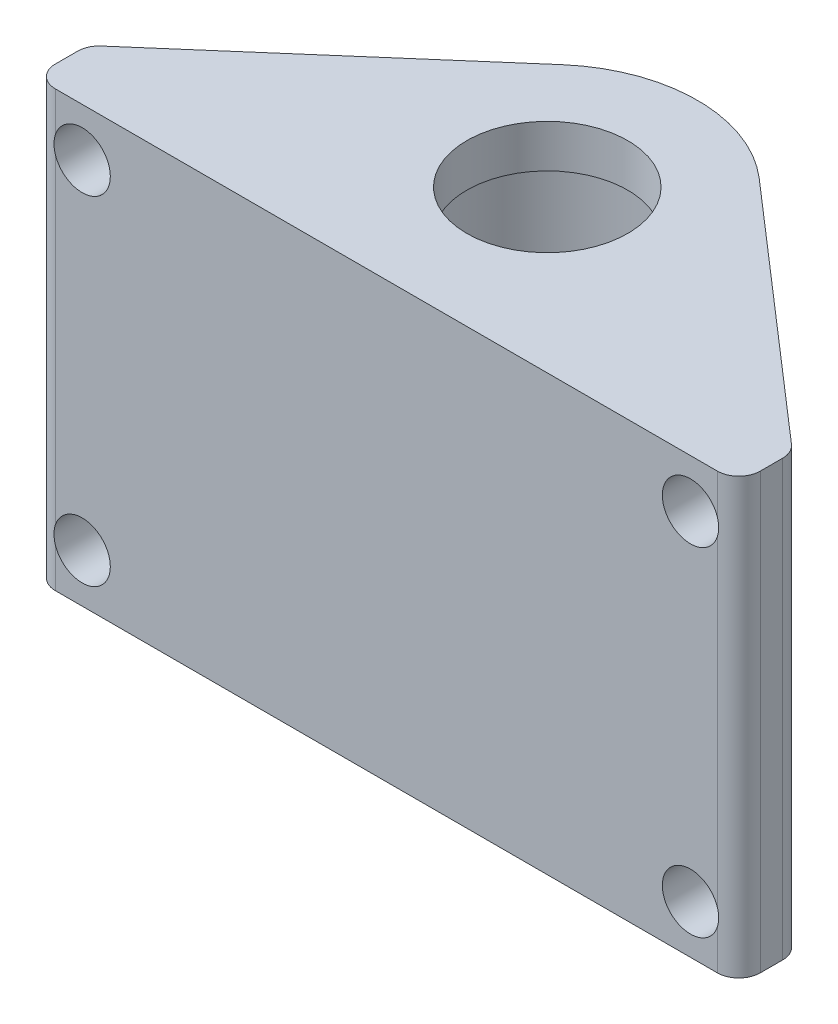
ISO-10303-21;
HEADER;
FILE_DESCRIPTION(('STEP AP214'),'2;1');
FILE_NAME('part.step','',(''),(''),'','','');
FILE_SCHEMA(('AUTOMOTIVE_DESIGN { 1 0 10303 214 1 1 1 1 }'));
ENDSEC;
DATA;
#1=APPLICATION_CONTEXT('core data for automotive mechanical design processes');
#2=APPLICATION_PROTOCOL_DEFINITION('international standard','automotive_design',2000,#1);
#3=PRODUCT_CONTEXT('',#1,'mechanical');
#4=PRODUCT('Part','Part','',(#3));
#5=PRODUCT_RELATED_PRODUCT_CATEGORY('part','',(#4));
#6=PRODUCT_DEFINITION_FORMATION('','',#4);
#7=PRODUCT_DEFINITION_CONTEXT('part definition',#1,'design');
#8=PRODUCT_DEFINITION('design','',#6,#7);
#9=PRODUCT_DEFINITION_SHAPE('','',#8);
#10=(LENGTH_UNIT() NAMED_UNIT(*) SI_UNIT(.MILLI.,.METRE.));
#11=(NAMED_UNIT(*) PLANE_ANGLE_UNIT() SI_UNIT($,.RADIAN.));
#12=(NAMED_UNIT(*) SI_UNIT($,.STERADIAN.) SOLID_ANGLE_UNIT());
#13=UNCERTAINTY_MEASURE_WITH_UNIT(LENGTH_MEASURE(1.E-05),#10,'distance_accuracy_value','');
#14=(GEOMETRIC_REPRESENTATION_CONTEXT(3) GLOBAL_UNCERTAINTY_ASSIGNED_CONTEXT((#13)) GLOBAL_UNIT_ASSIGNED_CONTEXT((#10,
#11,#12)) REPRESENTATION_CONTEXT('',''));
#15=CARTESIAN_POINT('',(0.,0.,0.));
#16=DIRECTION('',(0.,0.,1.));
#17=DIRECTION('',(1.,0.,0.));
#18=AXIS2_PLACEMENT_3D('',#15,#16,#17);
#19=CARTESIAN_POINT('',(21.0947550377728,-51.435,-24.2736863973737));
#20=DIRECTION('',(0.655952068796307,0.,-0.754802545995868));
#21=DIRECTION('',(-0.754802545995868,0.,-0.655952068796307));
#22=AXIS2_PLACEMENT_3D('',#19,#20,#21);
#23=PLANE('',#22);
#24=CARTESIAN_POINT('',(36.000000009,-5.71749999499999,-11.3204626348696));
#25=DIRECTION('',(0.655952068796307,0.,-0.754802545995868));
#26=DIRECTION('',(0.754802545995868,0.,0.655952068796307));
#27=AXIS2_PLACEMENT_3D('',#24,#25,#26);
#28=ELLIPSE('',#27,4.41671801146554,3.33375);
#29=CARTESIAN_POINT('',(39.333750009,-5.71749999499999,-8.42330731795887));
#30=VERTEX_POINT('',#29);
#31=EDGE_CURVE('E199',#30,#30,#28,.F.);
#32=ORIENTED_EDGE('',*,*,#31,.T.);
#33=EDGE_LOOP('',(#32));
#34=FACE_BOUND('',#33,.T.);
#35=DIRECTION('',(-0.754802545995868,0.,-0.655952068796307));
#36=VECTOR('',#35,1.);
#37=CARTESIAN_POINT('',(21.0947550377728,0.,-24.2736863973737));
#38=LINE('',#37,#36);
#39=CARTESIAN_POINT('',(40.8456182547426,0.,-7.10943641383536));
#40=VERTEX_POINT('',#39);
#41=CARTESIAN_POINT('',(11.6628277831983,0.,-32.4703892678065));
#42=VERTEX_POINT('',#41);
#43=EDGE_CURVE('E170',#40,#42,#38,.T.);
#44=ORIENTED_EDGE('',*,*,#43,.F.);
#45=DIRECTION('',(0.,1.,0.));
#46=VECTOR('',#45,1.);
#47=CARTESIAN_POINT('',(40.8456182547426,-51.435,-7.10943641383536));
#48=LINE('',#47,#46);
#49=CARTESIAN_POINT('',(40.8456182547426,-51.435,-7.10943641383536));
#50=VERTEX_POINT('',#49);
#51=EDGE_CURVE('E43',#40,#50,#48,.F.);
#52=ORIENTED_EDGE('',*,*,#51,.T.);
#53=DIRECTION('',(-0.754802545995868,0.,-0.655952068796307));
#54=VECTOR('',#53,1.);
#55=CARTESIAN_POINT('',(21.0947550377728,-51.435,-24.2736863973737));
#56=LINE('',#55,#54);
#57=CARTESIAN_POINT('',(11.6628277831983,-51.435,-32.4703892678065));
#58=VERTEX_POINT('',#57);
#59=EDGE_CURVE('E137',#50,#58,#56,.T.);
#60=ORIENTED_EDGE('',*,*,#59,.T.);
#61=DIRECTION('',(0.,1.,0.));
#62=VECTOR('',#61,1.);
#63=CARTESIAN_POINT('',(11.6628277831983,-51.435,-32.4703892678065));
#64=LINE('',#63,#62);
#65=EDGE_CURVE('E141',#58,#42,#64,.T.);
#66=ORIENTED_EDGE('',*,*,#65,.T.);
#67=EDGE_LOOP('',(#44,#52,#60,#66));
#68=FACE_BOUND('',#67,.T.);
#69=CARTESIAN_POINT('',(36.000000009,-45.717500005,-11.3204626348696));
#70=DIRECTION('',(0.655952068796307,0.,-0.754802545995868));
#71=DIRECTION('',(0.754802545995868,0.,0.655952068796307));
#72=AXIS2_PLACEMENT_3D('',#69,#70,#71);
#73=ELLIPSE('',#72,4.41671801146554,3.33375);
#74=CARTESIAN_POINT('',(39.333750009,-45.717500005,-8.42330731795887));
#75=VERTEX_POINT('',#74);
#76=EDGE_CURVE('E295',#75,#75,#73,.T.);
#77=ORIENTED_EDGE('',*,*,#76,.F.);
#78=EDGE_LOOP('',(#77));
#79=FACE_BOUND('',#78,.T.);
#80=ADVANCED_FACE('F35',(#34,#68,#79),#23,.T.);
#81=CARTESIAN_POINT('',(0.,-51.435,0.));
#82=DIRECTION('',(0.,0.,-1.));
#83=DIRECTION('',(-1.,0.,0.));
#84=AXIS2_PLACEMENT_3D('',#81,#82,#83);
#85=PLANE('',#84);
#86=DIRECTION('',(-1.,0.,0.));
#87=VECTOR('',#86,1.);
#88=CARTESIAN_POINT('',(0.,0.,0.));
#89=LINE('',#88,#87);
#90=CARTESIAN_POINT('',(39.1795,0.,0.));
#91=VERTEX_POINT('',#90);
#92=CARTESIAN_POINT('',(-39.1795,0.,0.));
#93=VERTEX_POINT('',#92);
#94=EDGE_CURVE('E179',#91,#93,#89,.T.);
#95=ORIENTED_EDGE('',*,*,#94,.T.);
#96=DIRECTION('',(0.,1.,0.));
#97=VECTOR('',#96,1.);
#98=CARTESIAN_POINT('',(-39.1795,-51.435,0.));
#99=LINE('',#98,#97);
#100=CARTESIAN_POINT('',(-39.1795,-4.71516827858523,0.));
#101=VERTEX_POINT('',#100);
#102=EDGE_CURVE('E223',#93,#101,#99,.F.);
#103=ORIENTED_EDGE('',*,*,#102,.T.);
#104=CARTESIAN_POINT('',(-36.000000009,-5.717499995,0.));
#105=DIRECTION('',(0.,0.,1.));
#106=DIRECTION('',(1.,0.,0.));
#107=AXIS2_PLACEMENT_3D('',#104,#105,#106);
#108=CIRCLE('',#107,3.33375);
#109=CARTESIAN_POINT('',(-39.1795,-6.71983171141477,0.));
#110=VERTEX_POINT('',#109);
#111=EDGE_CURVE('E196',#110,#101,#108,.T.);
#112=ORIENTED_EDGE('',*,*,#111,.F.);
#113=DIRECTION('',(0.,1.,0.));
#114=VECTOR('',#113,1.);
#115=CARTESIAN_POINT('',(-39.1795,-51.435,0.));
#116=LINE('',#115,#114);
#117=CARTESIAN_POINT('',(-39.1795,-44.7151682885852,0.));
#118=VERTEX_POINT('',#117);
#119=EDGE_CURVE('E221',#110,#118,#116,.F.);
#120=ORIENTED_EDGE('',*,*,#119,.T.);
#121=CARTESIAN_POINT('',(-36.000000009,-45.717500005,0.));
#122=DIRECTION('',(0.,0.,1.));
#123=DIRECTION('',(1.,0.,0.));
#124=AXIS2_PLACEMENT_3D('',#121,#122,#123);
#125=CIRCLE('',#124,3.33375);
#126=CARTESIAN_POINT('',(-39.1795,-46.7198317214148,0.));
#127=VERTEX_POINT('',#126);
#128=EDGE_CURVE('E315',#118,#127,#125,.F.);
#129=ORIENTED_EDGE('',*,*,#128,.T.);
#130=DIRECTION('',(0.,1.,0.));
#131=VECTOR('',#130,1.);
#132=CARTESIAN_POINT('',(-39.1795,-51.435,0.));
#133=LINE('',#132,#131);
#134=CARTESIAN_POINT('',(-39.1795,-51.435,0.));
#135=VERTEX_POINT('',#134);
#136=EDGE_CURVE('E219',#127,#135,#133,.F.);
#137=ORIENTED_EDGE('',*,*,#136,.T.);
#138=DIRECTION('',(-1.,0.,0.));
#139=VECTOR('',#138,1.);
#140=CARTESIAN_POINT('',(0.,-51.435,0.));
#141=LINE('',#140,#139);
#142=CARTESIAN_POINT('',(39.1795,-51.435,0.));
#143=VERTEX_POINT('',#142);
#144=EDGE_CURVE('E167',#143,#135,#141,.T.);
#145=ORIENTED_EDGE('',*,*,#144,.F.);
#146=DIRECTION('',(0.,1.,0.));
#147=VECTOR('',#146,1.);
#148=CARTESIAN_POINT('',(39.1795,0.,0.));
#149=LINE('',#148,#147);
#150=CARTESIAN_POINT('',(39.1795,-46.7198317214148,0.));
#151=VERTEX_POINT('',#150);
#152=EDGE_CURVE('E216',#143,#151,#149,.T.);
#153=ORIENTED_EDGE('',*,*,#152,.T.);
#154=CARTESIAN_POINT('',(36.000000009,-45.717500005,0.));
#155=DIRECTION('',(0.,0.,1.));
#156=DIRECTION('',(1.,0.,0.));
#157=AXIS2_PLACEMENT_3D('',#154,#155,#156);
#158=CIRCLE('',#157,3.33375);
#159=CARTESIAN_POINT('',(39.1795,-44.7151682885852,0.));
#160=VERTEX_POINT('',#159);
#161=EDGE_CURVE('E318',#160,#151,#158,.T.);
#162=ORIENTED_EDGE('',*,*,#161,.F.);
#163=DIRECTION('',(0.,1.,0.));
#164=VECTOR('',#163,1.);
#165=CARTESIAN_POINT('',(39.1795,0.,0.));
#166=LINE('',#165,#164);
#167=CARTESIAN_POINT('',(39.1795,-6.71983171141476,0.));
#168=VERTEX_POINT('',#167);
#169=EDGE_CURVE('E214',#160,#168,#166,.T.);
#170=ORIENTED_EDGE('',*,*,#169,.T.);
#171=CARTESIAN_POINT('',(36.000000009,-5.71749999499999,0.));
#172=DIRECTION('',(0.,0.,1.));
#173=DIRECTION('',(1.,0.,0.));
#174=AXIS2_PLACEMENT_3D('',#171,#172,#173);
#175=CIRCLE('',#174,3.33375);
#176=CARTESIAN_POINT('',(39.1795,-4.71516827858523,0.));
#177=VERTEX_POINT('',#176);
#178=EDGE_CURVE('E314',#168,#177,#175,.F.);
#179=ORIENTED_EDGE('',*,*,#178,.T.);
#180=DIRECTION('',(0.,1.,0.));
#181=VECTOR('',#180,1.);
#182=CARTESIAN_POINT('',(39.1795,0.,0.));
#183=LINE('',#182,#181);
#184=EDGE_CURVE('E212',#177,#91,#183,.T.);
#185=ORIENTED_EDGE('',*,*,#184,.T.);
#186=EDGE_LOOP('',(#95,#103,#112,#120,#129,#137,#145,#153,#162,#170,#179,#185));
#187=FACE_BOUND('',#186,.T.);
#188=ADVANCED_FACE('F277',(#187),#85,.F.);
#189=CARTESIAN_POINT('',(-21.0947550377728,-51.435,-24.2736863973737));
#190=DIRECTION('',(0.655952068796307,0.,0.754802545995868));
#191=DIRECTION('',(0.754802545995868,0.,-0.655952068796307));
#192=AXIS2_PLACEMENT_3D('',#189,#190,#191);
#193=PLANE('',#192);
#194=CARTESIAN_POINT('',(-36.000000009,-5.717499995,-11.3204626348696));
#195=DIRECTION('',(0.655952068796307,0.,0.754802545995868));
#196=DIRECTION('',(-0.754802545995868,0.,0.655952068796307));
#197=AXIS2_PLACEMENT_3D('',#194,#195,#196);
#198=ELLIPSE('',#197,4.41671801146554,3.33375);
#199=CARTESIAN_POINT('',(-39.333750009,-5.717499995,-8.42330731795887));
#200=VERTEX_POINT('',#199);
#201=EDGE_CURVE('E192',#200,#200,#198,.T.);
#202=ORIENTED_EDGE('',*,*,#201,.T.);
#203=EDGE_LOOP('',(#202));
#204=FACE_BOUND('',#203,.T.);
#205=DIRECTION('',(0.754802545995868,0.,-0.655952068796307));
#206=VECTOR('',#205,1.);
#207=CARTESIAN_POINT('',(-21.0947550377728,-51.435,-24.2736863973737));
#208=LINE('',#207,#206);
#209=CARTESIAN_POINT('',(-40.8456182547426,-51.435,-7.10943641383536));
#210=VERTEX_POINT('',#209);
#211=CARTESIAN_POINT('',(-11.6628277831983,-51.435,-32.4703892678065));
#212=VERTEX_POINT('',#211);
#213=EDGE_CURVE('E159',#210,#212,#208,.T.);
#214=ORIENTED_EDGE('',*,*,#213,.F.);
#215=DIRECTION('',(0.,1.,0.));
#216=VECTOR('',#215,1.);
#217=CARTESIAN_POINT('',(-40.8456182547426,-51.435,-7.10943641383536));
#218=LINE('',#217,#216);
#219=CARTESIAN_POINT('',(-40.8456182547426,0.,-7.10943641383536));
#220=VERTEX_POINT('',#219);
#221=EDGE_CURVE('E11',#210,#220,#218,.T.);
#222=ORIENTED_EDGE('',*,*,#221,.T.);
#223=DIRECTION('',(0.754802545995868,0.,-0.655952068796307));
#224=VECTOR('',#223,1.);
#225=CARTESIAN_POINT('',(-21.0947550377728,0.,-24.2736863973737));
#226=LINE('',#225,#224);
#227=CARTESIAN_POINT('',(-11.6628277831983,0.,-32.4703892678065));
#228=VERTEX_POINT('',#227);
#229=EDGE_CURVE('E174',#220,#228,#226,.T.);
#230=ORIENTED_EDGE('',*,*,#229,.T.);
#231=DIRECTION('',(0.,1.,0.));
#232=VECTOR('',#231,1.);
#233=CARTESIAN_POINT('',(-11.6628277831983,-51.435,-32.4703892678065));
#234=LINE('',#233,#232);
#235=EDGE_CURVE('E154',#212,#228,#234,.T.);
#236=ORIENTED_EDGE('',*,*,#235,.F.);
#237=EDGE_LOOP('',(#214,#222,#230,#236));
#238=FACE_BOUND('',#237,.T.);
#239=CARTESIAN_POINT('',(-36.000000009,-45.717500005,-11.3204626348696));
#240=DIRECTION('',(0.655952068796307,0.,0.754802545995868));
#241=DIRECTION('',(-0.754802545995868,0.,0.655952068796307));
#242=AXIS2_PLACEMENT_3D('',#239,#240,#241);
#243=ELLIPSE('',#242,4.41671801146554,3.33375);
#244=CARTESIAN_POINT('',(-39.333750009,-45.717500005,-8.42330731795887));
#245=VERTEX_POINT('',#244);
#246=EDGE_CURVE('E195',#245,#245,#243,.F.);
#247=ORIENTED_EDGE('',*,*,#246,.F.);
#248=EDGE_LOOP('',(#247));
#249=FACE_BOUND('',#248,.T.);
#250=ADVANCED_FACE('F275',(#204,#238,#249),#193,.F.);
#251=CARTESIAN_POINT('',(41.7195,-51.435,0.));
#252=DIRECTION('',(1.,0.,0.));
#253=DIRECTION('',(0.,0.,-1.));
#254=AXIS2_PLACEMENT_3D('',#251,#252,#253);
#255=PLANE('',#254);
#256=DIRECTION('',(0.,0.,-1.));
#257=VECTOR('',#256,1.);
#258=CARTESIAN_POINT('',(41.7195,0.,0.));
#259=LINE('',#258,#257);
#260=CARTESIAN_POINT('',(41.7195,0.,-2.54));
#261=VERTEX_POINT('',#260);
#262=CARTESIAN_POINT('',(41.7195,0.,-5.19223794700585));
#263=VERTEX_POINT('',#262);
#264=EDGE_CURVE('E182',#261,#263,#259,.T.);
#265=ORIENTED_EDGE('',*,*,#264,.F.);
#266=DIRECTION('',(0.,1.,0.));
#267=VECTOR('',#266,1.);
#268=CARTESIAN_POINT('',(41.7195,-51.435,-2.54));
#269=LINE('',#268,#267);
#270=CARTESIAN_POINT('',(41.7195,-51.435,-2.54));
#271=VERTEX_POINT('',#270);
#272=EDGE_CURVE('E335',#261,#271,#269,.F.);
#273=ORIENTED_EDGE('',*,*,#272,.T.);
#274=DIRECTION('',(0.,0.,-1.));
#275=VECTOR('',#274,1.);
#276=CARTESIAN_POINT('',(41.7195,-51.435,0.));
#277=LINE('',#276,#275);
#278=CARTESIAN_POINT('',(41.7195,-51.435,-5.19223794700585));
#279=VERTEX_POINT('',#278);
#280=EDGE_CURVE('E155',#271,#279,#277,.T.);
#281=ORIENTED_EDGE('',*,*,#280,.T.);
#282=DIRECTION('',(0.,1.,0.));
#283=VECTOR('',#282,1.);
#284=CARTESIAN_POINT('',(41.7195,-51.435,-5.19223794700585));
#285=LINE('',#284,#283);
#286=EDGE_CURVE('E340',#279,#263,#285,.T.);
#287=ORIENTED_EDGE('',*,*,#286,.T.);
#288=EDGE_LOOP('',(#265,#273,#281,#287));
#289=FACE_BOUND('',#288,.T.);
#290=ADVANCED_FACE('F271',(#289),#255,.T.);
#291=CARTESIAN_POINT('',(-41.7195,-51.435,0.));
#292=DIRECTION('',(1.,0.,0.));
#293=DIRECTION('',(0.,0.,-1.));
#294=AXIS2_PLACEMENT_3D('',#291,#292,#293);
#295=PLANE('',#294);
#296=DIRECTION('',(0.,0.,-1.));
#297=VECTOR('',#296,1.);
#298=CARTESIAN_POINT('',(-41.7195,-51.435,0.));
#299=LINE('',#298,#297);
#300=CARTESIAN_POINT('',(-41.7195,-51.435,-2.54));
#301=VERTEX_POINT('',#300);
#302=CARTESIAN_POINT('',(-41.7195,-51.435,-5.19223794700585));
#303=VERTEX_POINT('',#302);
#304=EDGE_CURVE('E162',#301,#303,#299,.T.);
#305=ORIENTED_EDGE('',*,*,#304,.F.);
#306=DIRECTION('',(0.,1.,0.));
#307=VECTOR('',#306,1.);
#308=CARTESIAN_POINT('',(-41.7195,-51.435,-2.54));
#309=LINE('',#308,#307);
#310=CARTESIAN_POINT('',(-41.7195,0.,-2.54));
#311=VERTEX_POINT('',#310);
#312=EDGE_CURVE('E201',#301,#311,#309,.T.);
#313=ORIENTED_EDGE('',*,*,#312,.T.);
#314=DIRECTION('',(0.,0.,-1.));
#315=VECTOR('',#314,1.);
#316=CARTESIAN_POINT('',(-41.7195,0.,0.));
#317=LINE('',#316,#315);
#318=CARTESIAN_POINT('',(-41.7195,0.,-5.19223794700585));
#319=VERTEX_POINT('',#318);
#320=EDGE_CURVE('E176',#311,#319,#317,.T.);
#321=ORIENTED_EDGE('',*,*,#320,.T.);
#322=DIRECTION('',(0.,1.,0.));
#323=VECTOR('',#322,1.);
#324=CARTESIAN_POINT('',(-41.7195,-51.435,-5.19223794700585));
#325=LINE('',#324,#323);
#326=EDGE_CURVE('E187',#319,#303,#325,.F.);
#327=ORIENTED_EDGE('',*,*,#326,.T.);
#328=EDGE_LOOP('',(#305,#313,#321,#327));
#329=FACE_BOUND('',#328,.T.);
#330=ADVANCED_FACE('F274',(#329),#295,.F.);
#331=CARTESIAN_POINT('',(0.,-51.435,-19.05));
#332=DIRECTION('',(0.,1.,0.));
#333=DIRECTION('',(0.,0.,1.));
#334=AXIS2_PLACEMENT_3D('',#331,#332,#333);
#335=CYLINDRICAL_SURFACE('',#334,17.78);
#336=CARTESIAN_POINT('',(0.,0.,-19.05));
#337=DIRECTION('',(0.,1.,0.));
#338=DIRECTION('',(0.,0.,1.));
#339=AXIS2_PLACEMENT_3D('',#336,#337,#338);
#340=CIRCLE('',#339,17.78);
#341=EDGE_CURVE('E153',#42,#228,#340,.T.);
#342=ORIENTED_EDGE('',*,*,#341,.F.);
#343=ORIENTED_EDGE('',*,*,#65,.F.);
#344=CARTESIAN_POINT('',(0.,-51.435,-19.05));
#345=DIRECTION('',(0.,1.,0.));
#346=DIRECTION('',(0.,0.,1.));
#347=AXIS2_PLACEMENT_3D('',#344,#345,#346);
#348=CIRCLE('',#347,17.78);
#349=EDGE_CURVE('E145',#58,#212,#348,.T.);
#350=ORIENTED_EDGE('',*,*,#349,.T.);
#351=ORIENTED_EDGE('',*,*,#235,.T.);
#352=EDGE_LOOP('',(#342,#343,#350,#351));
#353=FACE_BOUND('',#352,.T.);
#354=ADVANCED_FACE('F150',(#353),#335,.T.);
#355=CARTESIAN_POINT('',(0.,-51.435,-19.05));
#356=DIRECTION('',(0.,1.,0.));
#357=DIRECTION('',(0.,0.,1.));
#358=AXIS2_PLACEMENT_3D('',#355,#356,#357);
#359=CYLINDRICAL_SURFACE('',#358,9.525);
#360=CARTESIAN_POINT('',(0.,-5.08,-19.05));
#361=DIRECTION('',(0.,1.,0.));
#362=DIRECTION('',(0.,0.,1.));
#363=AXIS2_PLACEMENT_3D('',#360,#361,#362);
#364=CIRCLE('',#363,9.525);
#365=CARTESIAN_POINT('',(0.,-5.08,-9.52499999999999));
#366=VERTEX_POINT('',#365);
#367=EDGE_CURVE('E172',#366,#366,#364,.F.);
#368=ORIENTED_EDGE('',*,*,#367,.T.);
#369=EDGE_LOOP('',(#368));
#370=FACE_BOUND('',#369,.T.);
#371=CARTESIAN_POINT('',(0.,0.,-19.05));
#372=DIRECTION('',(0.,1.,0.));
#373=DIRECTION('',(0.,0.,1.));
#374=AXIS2_PLACEMENT_3D('',#371,#372,#373);
#375=CIRCLE('',#374,9.525);
#376=CARTESIAN_POINT('',(0.,0.,-9.52499999999999));
#377=VERTEX_POINT('',#376);
#378=EDGE_CURVE('E146',#377,#377,#375,.T.);
#379=ORIENTED_EDGE('',*,*,#378,.T.);
#380=EDGE_LOOP('',(#379));
#381=FACE_BOUND('',#380,.T.);
#382=ADVANCED_FACE('F263',(#370,#381),#359,.F.);
#383=CARTESIAN_POINT('',(0.,-51.435,0.));
#384=DIRECTION('',(0.,1.,0.));
#385=DIRECTION('',(0.,0.,1.));
#386=AXIS2_PLACEMENT_3D('',#383,#384,#385);
#387=PLANE('',#386);
#388=CARTESIAN_POINT('',(0.,-51.435,-19.05));
#389=DIRECTION('',(0.,1.,0.));
#390=DIRECTION('',(0.,0.,1.));
#391=AXIS2_PLACEMENT_3D('',#388,#389,#390);
#392=CIRCLE('',#391,12.7);
#393=CARTESIAN_POINT('',(0.,-51.435,-6.34999999999999));
#394=VERTEX_POINT('',#393);
#395=EDGE_CURVE('E191',#394,#394,#392,.T.);
#396=ORIENTED_EDGE('',*,*,#395,.T.);
#397=EDGE_LOOP('',(#396));
#398=FACE_BOUND('',#397,.T.);
#399=ORIENTED_EDGE('',*,*,#144,.T.);
#400=CARTESIAN_POINT('',(-39.1795,-51.435,-2.54));
#401=DIRECTION('',(0.,1.,0.));
#402=DIRECTION('',(0.,0.,1.));
#403=AXIS2_PLACEMENT_3D('',#400,#401,#402);
#404=CIRCLE('',#403,2.54);
#405=EDGE_CURVE('E370',#135,#301,#404,.F.);
#406=ORIENTED_EDGE('',*,*,#405,.T.);
#407=ORIENTED_EDGE('',*,*,#304,.T.);
#408=CARTESIAN_POINT('',(-39.1795,-51.435,-5.19223794700585));
#409=DIRECTION('',(0.,1.,0.));
#410=DIRECTION('',(0.,0.,1.));
#411=AXIS2_PLACEMENT_3D('',#408,#409,#410);
#412=CIRCLE('',#411,2.54);
#413=EDGE_CURVE('E50',#303,#210,#412,.F.);
#414=ORIENTED_EDGE('',*,*,#413,.T.);
#415=ORIENTED_EDGE('',*,*,#213,.T.);
#416=ORIENTED_EDGE('',*,*,#349,.F.);
#417=ORIENTED_EDGE('',*,*,#59,.F.);
#418=CARTESIAN_POINT('',(39.1795,-51.435,-5.19223794700585));
#419=DIRECTION('',(0.,1.,0.));
#420=DIRECTION('',(0.,0.,1.));
#421=AXIS2_PLACEMENT_3D('',#418,#419,#420);
#422=CIRCLE('',#421,2.54);
#423=EDGE_CURVE('E57',#50,#279,#422,.F.);
#424=ORIENTED_EDGE('',*,*,#423,.T.);
#425=ORIENTED_EDGE('',*,*,#280,.F.);
#426=CARTESIAN_POINT('',(39.1795,-51.435,-2.54));
#427=DIRECTION('',(0.,1.,0.));
#428=DIRECTION('',(0.,0.,1.));
#429=AXIS2_PLACEMENT_3D('',#426,#427,#428);
#430=CIRCLE('',#429,2.54);
#431=EDGE_CURVE('E368',#271,#143,#430,.F.);
#432=ORIENTED_EDGE('',*,*,#431,.T.);
#433=EDGE_LOOP('',(#399,#406,#407,#414,#415,#416,#417,#424,#425,#432));
#434=FACE_BOUND('',#433,.T.);
#435=ADVANCED_FACE('F158',(#398,#434),#387,.F.);
#436=CARTESIAN_POINT('',(0.,0.,0.));
#437=DIRECTION('',(0.,1.,0.));
#438=DIRECTION('',(0.,0.,1.));
#439=AXIS2_PLACEMENT_3D('',#436,#437,#438);
#440=PLANE('',#439);
#441=ORIENTED_EDGE('',*,*,#320,.F.);
#442=CARTESIAN_POINT('',(-39.1795,0.,-2.54));
#443=DIRECTION('',(0.,1.,0.));
#444=DIRECTION('',(0.,0.,1.));
#445=AXIS2_PLACEMENT_3D('',#442,#443,#444);
#446=CIRCLE('',#445,2.54);
#447=EDGE_CURVE('E210',#311,#93,#446,.T.);
#448=ORIENTED_EDGE('',*,*,#447,.T.);
#449=ORIENTED_EDGE('',*,*,#94,.F.);
#450=CARTESIAN_POINT('',(39.1795,0.,-2.54));
#451=DIRECTION('',(0.,1.,0.));
#452=DIRECTION('',(0.,0.,1.));
#453=AXIS2_PLACEMENT_3D('',#450,#451,#452);
#454=CIRCLE('',#453,2.54);
#455=EDGE_CURVE('E208',#91,#261,#454,.T.);
#456=ORIENTED_EDGE('',*,*,#455,.T.);
#457=ORIENTED_EDGE('',*,*,#264,.T.);
#458=CARTESIAN_POINT('',(39.1795,0.,-5.19223794700585));
#459=DIRECTION('',(0.,1.,0.));
#460=DIRECTION('',(0.,0.,1.));
#461=AXIS2_PLACEMENT_3D('',#458,#459,#460);
#462=CIRCLE('',#461,2.54);
#463=EDGE_CURVE('E206',#263,#40,#462,.T.);
#464=ORIENTED_EDGE('',*,*,#463,.T.);
#465=ORIENTED_EDGE('',*,*,#43,.T.);
#466=ORIENTED_EDGE('',*,*,#341,.T.);
#467=ORIENTED_EDGE('',*,*,#229,.F.);
#468=CARTESIAN_POINT('',(-39.1795,0.,-5.19223794700585));
#469=DIRECTION('',(0.,1.,0.));
#470=DIRECTION('',(0.,0.,1.));
#471=AXIS2_PLACEMENT_3D('',#468,#469,#470);
#472=CIRCLE('',#471,2.54);
#473=EDGE_CURVE('E204',#220,#319,#472,.T.);
#474=ORIENTED_EDGE('',*,*,#473,.T.);
#475=EDGE_LOOP('',(#441,#448,#449,#456,#457,#464,#465,#466,#467,#474));
#476=FACE_BOUND('',#475,.T.);
#477=ORIENTED_EDGE('',*,*,#378,.F.);
#478=EDGE_LOOP('',(#477));
#479=FACE_BOUND('',#478,.T.);
#480=ADVANCED_FACE('F256',(#476,#479),#440,.T.);
#481=CARTESIAN_POINT('',(0.,-5.08,-19.05));
#482=DIRECTION('',(0.,1.,0.));
#483=DIRECTION('',(0.,0.,1.));
#484=AXIS2_PLACEMENT_3D('',#481,#482,#483);
#485=PLANE('',#484);
#486=CARTESIAN_POINT('',(0.,-5.08,-19.05));
#487=DIRECTION('',(0.,1.,0.));
#488=DIRECTION('',(0.,0.,1.));
#489=AXIS2_PLACEMENT_3D('',#486,#487,#488);
#490=CIRCLE('',#489,12.7);
#491=CARTESIAN_POINT('',(0.,-5.07999999999999,-6.34999999999999));
#492=VERTEX_POINT('',#491);
#493=EDGE_CURVE('E298',#492,#492,#490,.T.);
#494=ORIENTED_EDGE('',*,*,#493,.F.);
#495=EDGE_LOOP('',(#494));
#496=FACE_BOUND('',#495,.T.);
#497=ORIENTED_EDGE('',*,*,#367,.F.);
#498=EDGE_LOOP('',(#497));
#499=FACE_BOUND('',#498,.T.);
#500=ADVANCED_FACE('F253',(#496,#499),#485,.F.);
#501=CARTESIAN_POINT('',(0.,-51.435,-19.05));
#502=DIRECTION('',(0.,1.,0.));
#503=DIRECTION('',(0.,0.,1.));
#504=AXIS2_PLACEMENT_3D('',#501,#502,#503);
#505=CYLINDRICAL_SURFACE('',#504,12.7);
#506=CARTESIAN_POINT('',(0.,-51.435,-6.34999999999999));
#507=CARTESIAN_POINT('',(0.,-50.9521354166667,-6.34999999999999));
#508=CARTESIAN_POINT('',(0.,-50.4692708333333,-6.34999999999999));
#509=CARTESIAN_POINT('',(0.,-49.5035416666667,-6.34999999999999));
#510=CARTESIAN_POINT('',(0.,-49.0206770833333,-6.34999999999999));
#511=CARTESIAN_POINT('',(0.,-48.0549479166667,-6.34999999999999));
#512=CARTESIAN_POINT('',(0.,-47.5720833333333,-6.34999999999999));
#513=CARTESIAN_POINT('',(0.,-46.6063541666667,-6.34999999999999));
#514=CARTESIAN_POINT('',(0.,-46.1234895833333,-6.34999999999999));
#515=CARTESIAN_POINT('',(0.,-45.1577604166667,-6.34999999999999));
#516=CARTESIAN_POINT('',(0.,-44.6748958333333,-6.34999999999999));
#517=CARTESIAN_POINT('',(0.,-43.7091666666667,-6.34999999999999));
#518=CARTESIAN_POINT('',(0.,-43.2263020833333,-6.34999999999999));
#519=CARTESIAN_POINT('',(0.,-42.2605729166667,-6.34999999999999));
#520=CARTESIAN_POINT('',(0.,-41.7777083333333,-6.34999999999999));
#521=CARTESIAN_POINT('',(0.,-40.8119791666667,-6.34999999999999));
#522=CARTESIAN_POINT('',(0.,-40.3291145833333,-6.34999999999999));
#523=CARTESIAN_POINT('',(0.,-39.3633854166667,-6.34999999999999));
#524=CARTESIAN_POINT('',(0.,-38.8805208333333,-6.34999999999999));
#525=CARTESIAN_POINT('',(0.,-37.9147916666667,-6.34999999999999));
#526=CARTESIAN_POINT('',(0.,-37.4319270833333,-6.34999999999999));
#527=CARTESIAN_POINT('',(0.,-36.4661979166667,-6.34999999999999));
#528=CARTESIAN_POINT('',(0.,-35.9833333333333,-6.34999999999999));
#529=CARTESIAN_POINT('',(0.,-35.0176041666667,-6.34999999999999));
#530=CARTESIAN_POINT('',(0.,-34.5347395833333,-6.34999999999999));
#531=CARTESIAN_POINT('',(0.,-33.5690104166667,-6.34999999999999));
#532=CARTESIAN_POINT('',(0.,-33.0861458333333,-6.34999999999999));
#533=CARTESIAN_POINT('',(0.,-32.1204166666667,-6.34999999999999));
#534=CARTESIAN_POINT('',(0.,-31.6375520833333,-6.34999999999999));
#535=CARTESIAN_POINT('',(0.,-30.6718229166667,-6.34999999999999));
#536=CARTESIAN_POINT('',(0.,-30.1889583333333,-6.34999999999999));
#537=CARTESIAN_POINT('',(0.,-29.2232291666667,-6.34999999999999));
#538=CARTESIAN_POINT('',(0.,-28.7403645833333,-6.34999999999999));
#539=CARTESIAN_POINT('',(0.,-27.7746354166667,-6.34999999999999));
#540=CARTESIAN_POINT('',(0.,-27.2917708333333,-6.34999999999999));
#541=CARTESIAN_POINT('',(0.,-26.3260416666667,-6.34999999999999));
#542=CARTESIAN_POINT('',(0.,-25.8431770833333,-6.34999999999999));
#543=CARTESIAN_POINT('',(0.,-24.8774479166667,-6.34999999999999));
#544=CARTESIAN_POINT('',(0.,-24.3945833333333,-6.34999999999999));
#545=CARTESIAN_POINT('',(0.,-23.4288541666667,-6.34999999999999));
#546=CARTESIAN_POINT('',(0.,-22.9459895833333,-6.34999999999999));
#547=CARTESIAN_POINT('',(0.,-21.9802604166667,-6.34999999999999));
#548=CARTESIAN_POINT('',(0.,-21.4973958333333,-6.34999999999999));
#549=CARTESIAN_POINT('',(0.,-20.5316666666667,-6.34999999999999));
#550=CARTESIAN_POINT('',(0.,-20.0488020833333,-6.34999999999999));
#551=CARTESIAN_POINT('',(0.,-19.0830729166667,-6.34999999999999));
#552=CARTESIAN_POINT('',(0.,-18.6002083333333,-6.34999999999999));
#553=CARTESIAN_POINT('',(0.,-17.6344791666667,-6.34999999999999));
#554=CARTESIAN_POINT('',(0.,-17.1516145833333,-6.34999999999999));
#555=CARTESIAN_POINT('',(0.,-16.1858854166667,-6.34999999999999));
#556=CARTESIAN_POINT('',(0.,-15.7030208333333,-6.34999999999999));
#557=CARTESIAN_POINT('',(0.,-14.7372916666667,-6.34999999999999));
#558=CARTESIAN_POINT('',(0.,-14.2544270833333,-6.34999999999999));
#559=CARTESIAN_POINT('',(0.,-13.2886979166667,-6.34999999999999));
#560=CARTESIAN_POINT('',(0.,-12.8058333333333,-6.34999999999999));
#561=CARTESIAN_POINT('',(0.,-11.8401041666667,-6.34999999999999));
#562=CARTESIAN_POINT('',(0.,-11.3572395833333,-6.34999999999999));
#563=CARTESIAN_POINT('',(0.,-10.3915104166667,-6.34999999999999));
#564=CARTESIAN_POINT('',(0.,-9.90864583333333,-6.34999999999999));
#565=CARTESIAN_POINT('',(0.,-8.94291666666666,-6.34999999999999));
#566=CARTESIAN_POINT('',(0.,-8.46005208333333,-6.34999999999999));
#567=CARTESIAN_POINT('',(0.,-7.49432291666666,-6.34999999999999));
#568=CARTESIAN_POINT('',(0.,-7.01145833333333,-6.34999999999999));
#569=CARTESIAN_POINT('',(0.,-6.04572916666666,-6.34999999999999));
#570=CARTESIAN_POINT('',(0.,-5.56286458333333,-6.34999999999999));
#571=CARTESIAN_POINT('',(0.,-5.07999999999999,-6.34999999999999));
#572=B_SPLINE_CURVE_WITH_KNOTS('',3,(#506,#507,#508,#509,#510,#511,#512,#513,#514,#515,#516,
#517,#518,#519,#520,#521,#522,#523,#524,#525,#526,#527,#528,#529,#530,#531,#532,#533,#534,#535,
#536,#537,#538,#539,#540,#541,#542,#543,#544,#545,#546,#547,#548,#549,#550,#551,#552,#553,#554,
#555,#556,#557,#558,#559,#560,#561,#562,#563,#564,#565,#566,#567,#568,#569,#570,#571),
.UNSPECIFIED.,.F.,.F.,(4,2,2,2,2,2,2,2,2,2,2,2,2,2,2,2,2,2,2,2,2,2,2,2,2,2,2,2,2,2,2,2,4),(0.,
1.44859375,2.8971875,4.34578125,5.794375,7.24296874999999,8.6915625,10.14015625,11.58875,
13.03734375,14.4859375,15.93453125,17.383125,18.83171875,20.2803125,21.72890625,23.1775,
24.62609375,26.0746875,27.52328125,28.971875,30.42046875,31.8690625,33.31765625,34.76625,
36.21484375,37.6634375,39.11203125,40.560625,42.00921875,43.4578125,44.90640625,46.355),.UNSPECIFIED.);
#573=EDGE_CURVE('BSEAM249',#394,#492,#572,.T.);
#574=ORIENTED_EDGE('',*,*,#395,.F.);
#575=ORIENTED_EDGE('',*,*,#493,.T.);
#576=ORIENTED_EDGE('',*,*,#573,.T.);
#577=ORIENTED_EDGE('',*,*,#573,.F.);
#578=EDGE_LOOP('',(#574,#576,#575,#577));
#579=FACE_BOUND('',#578,.T.);
#580=ADVANCED_FACE('F249',(#579),#505,.F.);
#581=CARTESIAN_POINT('',(-36.000000009,-5.717499995,-36.83));
#582=DIRECTION('',(0.,0.,1.));
#583=DIRECTION('',(1.,0.,0.));
#584=AXIS2_PLACEMENT_3D('',#581,#582,#583);
#585=CYLINDRICAL_SURFACE('',#584,3.33375);
#586=ORIENTED_EDGE('',*,*,#111,.T.);
#587=CARTESIAN_POINT('',(-39.1795,-4.71516827858523,0.));
#588=CARTESIAN_POINT('',(-39.1960617200469,-4.76770403639957,-2.88076229618965E-06));
#589=CARTESIAN_POINT('',(-39.2113182610125,-4.82064090438852,-0.000161552774359476));
#590=CARTESIAN_POINT('',(-39.2391906617561,-4.92720434478483,-0.000662715148670126));
#591=CARTESIAN_POINT('',(-39.2518065301248,-4.98083091494781,-0.00100520491290415));
#592=CARTESIAN_POINT('',(-39.2856483409078,-5.1425795507336,-0.00211677608651915));
#593=CARTESIAN_POINT('',(-39.3028676788911,-5.25156797031461,-0.0029699467831359));
#594=CARTESIAN_POINT('',(-39.3260882846867,-5.46753456505295,-0.00420795860384838));
#595=CARTESIAN_POINT('',(-39.3323988929116,-5.57448000922065,-0.00460560219897442));
#596=CARTESIAN_POINT('',(-39.3347112834678,-5.78842013990482,-0.00474669550321733));
#597=CARTESIAN_POINT('',(-39.3307186526918,-5.89541476829336,-0.00449049975508373));
#598=CARTESIAN_POINT('',(-39.3112459238117,-6.12273418773525,-0.00339606678016773));
#599=CARTESIAN_POINT('',(-39.2943086468143,-6.24293930396993,-0.00248495129382831));
#600=CARTESIAN_POINT('',(-39.2589848534156,-6.42227719167054,-0.00121747804677667));
#601=CARTESIAN_POINT('',(-39.24540020272,-6.4823951445868,-0.000808519203277497));
#602=CARTESIAN_POINT('',(-39.2149216190968,-6.60178598804488,-0.000202025270433159));
#603=CARTESIAN_POINT('',(-39.1980277508572,-6.66105889508124,-4.48604877683041E-06));
#604=CARTESIAN_POINT('',(-39.1795,-6.71983171141476,0.));
#605=B_SPLINE_CURVE_WITH_KNOTS('',3,(#587,#588,#589,#590,#591,#592,#593,#594,#595,#596,#597,
#598,#599,#600,#601,#602,#603,#604),.UNSPECIFIED.,.F.,.F.,(4,2,2,2,2,2,2,2,4),(0.,
0.165216865236663,0.330433192977415,0.66087390048775,0.981780387494059,1.30251290073641,
1.66590195790713,1.85072568670602,2.03554580295892),.UNSPECIFIED.);
#606=EDGE_CURVE('E225',#101,#110,#605,.T.);
#607=ORIENTED_EDGE('',*,*,#606,.T.);
#608=EDGE_LOOP('',(#586,#607));
#609=FACE_BOUND('',#608,.T.);
#610=ORIENTED_EDGE('',*,*,#201,.F.);
#611=EDGE_LOOP('',(#610));
#612=FACE_BOUND('',#611,.T.);
#613=ADVANCED_FACE('F244',(#609,#612),#585,.F.);
#614=CARTESIAN_POINT('',(-36.000000009,-45.717500005,-36.83));
#615=DIRECTION('',(0.,0.,1.));
#616=DIRECTION('',(1.,0.,0.));
#617=AXIS2_PLACEMENT_3D('',#614,#615,#616);
#618=CYLINDRICAL_SURFACE('',#617,3.33375);
#619=ORIENTED_EDGE('',*,*,#128,.F.);
#620=CARTESIAN_POINT('',(-39.1795,-44.7151682885852,0.));
#621=CARTESIAN_POINT('',(-39.1960617200469,-44.7677040463996,-2.88076229619583E-06));
#622=CARTESIAN_POINT('',(-39.2113182610125,-44.8206409143885,-0.000161552774359485));
#623=CARTESIAN_POINT('',(-39.2391906617561,-44.9272043547848,-0.000662715148670103));
#624=CARTESIAN_POINT('',(-39.2518065301248,-44.9808309249478,-0.00100520491290408));
#625=CARTESIAN_POINT('',(-39.2856483409078,-45.1425795607336,-0.00211677608651895));
#626=CARTESIAN_POINT('',(-39.3028676788911,-45.2515679803146,-0.00296994678313562));
#627=CARTESIAN_POINT('',(-39.3260882846867,-45.4675345750529,-0.00420795860384837));
#628=CARTESIAN_POINT('',(-39.3323988929116,-45.5744800192206,-0.00460560219897474));
#629=CARTESIAN_POINT('',(-39.3347112834678,-45.7884201499048,-0.00474669550321766));
#630=CARTESIAN_POINT('',(-39.3307186526918,-45.8954147782934,-0.00449049975508372));
#631=CARTESIAN_POINT('',(-39.3112459238117,-46.1227341977352,-0.00339606678016745));
#632=CARTESIAN_POINT('',(-39.2943086468143,-46.2429393139699,-0.00248495129382814));
#633=CARTESIAN_POINT('',(-39.2589848534156,-46.4222772016705,-0.00121747804677666));
#634=CARTESIAN_POINT('',(-39.24540020272,-46.4823951545868,-0.00080851920327753));
#635=CARTESIAN_POINT('',(-39.2149216190968,-46.6017859980449,-0.000202025270433206));
#636=CARTESIAN_POINT('',(-39.1980277508572,-46.6610589050812,-4.48604877684717E-06));
#637=CARTESIAN_POINT('',(-39.1795,-46.7198317214148,0.));
#638=B_SPLINE_CURVE_WITH_KNOTS('',3,(#620,#621,#622,#623,#624,#625,#626,#627,#628,#629,#630,
#631,#632,#633,#634,#635,#636,#637),.UNSPECIFIED.,.F.,.F.,(4,2,2,2,2,2,2,2,4),(0.,
0.165216865236666,0.330433192977407,0.660873900487746,0.981780387494053,1.3025129007364,
1.66590195790714,1.85072568670603,2.03554580295893),.UNSPECIFIED.);
#639=EDGE_CURVE('E233',#118,#127,#638,.T.);
#640=ORIENTED_EDGE('',*,*,#639,.T.);
#641=EDGE_LOOP('',(#619,#640));
#642=FACE_BOUND('',#641,.T.);
#643=ORIENTED_EDGE('',*,*,#246,.T.);
#644=EDGE_LOOP('',(#643));
#645=FACE_BOUND('',#644,.T.);
#646=ADVANCED_FACE('F248',(#642,#645),#618,.F.);
#647=CARTESIAN_POINT('',(36.000000009,-5.71749999499999,-36.83));
#648=DIRECTION('',(0.,0.,1.));
#649=DIRECTION('',(1.,0.,0.));
#650=AXIS2_PLACEMENT_3D('',#647,#648,#649);
#651=CYLINDRICAL_SURFACE('',#650,3.33375);
#652=ORIENTED_EDGE('',*,*,#31,.F.);
#653=EDGE_LOOP('',(#652));
#654=FACE_BOUND('',#653,.T.);
#655=ORIENTED_EDGE('',*,*,#178,.F.);
#656=CARTESIAN_POINT('',(39.1795,-6.71983171141476,0.));
#657=CARTESIAN_POINT('',(39.1960617200469,-6.66729595360042,-2.88076229618965E-06));
#658=CARTESIAN_POINT('',(39.2113182610125,-6.61435908561147,-0.000161552774359476));
#659=CARTESIAN_POINT('',(39.2391906617561,-6.50779564521517,-0.000662715148670126));
#660=CARTESIAN_POINT('',(39.2518065301248,-6.45416907505218,-0.00100520491290415));
#661=CARTESIAN_POINT('',(39.2856483409078,-6.29242043926639,-0.00211677608651915));
#662=CARTESIAN_POINT('',(39.3028676788911,-6.18343201968539,-0.0029699467831359));
#663=CARTESIAN_POINT('',(39.3260882846867,-5.96746542494704,-0.00420795860384838));
#664=CARTESIAN_POINT('',(39.3323988929116,-5.86051998077934,-0.00460560219897442));
#665=CARTESIAN_POINT('',(39.3347112834678,-5.64657985009518,-0.00474669550321733));
#666=CARTESIAN_POINT('',(39.3307186526918,-5.53958522170663,-0.00449049975508373));
#667=CARTESIAN_POINT('',(39.3112459238117,-5.31226580226474,-0.00339606678016773));
#668=CARTESIAN_POINT('',(39.2943086468143,-5.19206068603006,-0.00248495129382831));
#669=CARTESIAN_POINT('',(39.2589848534156,-5.01272279832945,-0.00121747804677667));
#670=CARTESIAN_POINT('',(39.24540020272,-4.95260484541319,-0.000808519203277497));
#671=CARTESIAN_POINT('',(39.2149216190968,-4.83321400195511,-0.000202025270433159));
#672=CARTESIAN_POINT('',(39.1980277508572,-4.77394109491875,-4.48604877683041E-06));
#673=CARTESIAN_POINT('',(39.1795,-4.71516827858523,0.));
#674=B_SPLINE_CURVE_WITH_KNOTS('',3,(#656,#657,#658,#659,#660,#661,#662,#663,#664,#665,#666,
#667,#668,#669,#670,#671,#672,#673),.UNSPECIFIED.,.F.,.F.,(4,2,2,2,2,2,2,2,4),(0.,
0.165216865236663,0.330433192977415,0.66087390048775,0.981780387494059,1.30251290073641,
1.66590195790713,1.85072568670602,2.03554580295892),.UNSPECIFIED.);
#675=EDGE_CURVE('E333',#168,#177,#674,.T.);
#676=ORIENTED_EDGE('',*,*,#675,.T.);
#677=EDGE_LOOP('',(#655,#676));
#678=FACE_BOUND('',#677,.T.);
#679=ADVANCED_FACE('F357',(#654,#678),#651,.F.);
#680=CARTESIAN_POINT('',(36.000000009,-45.717500005,-36.83));
#681=DIRECTION('',(0.,0.,1.));
#682=DIRECTION('',(1.,0.,0.));
#683=AXIS2_PLACEMENT_3D('',#680,#681,#682);
#684=CYLINDRICAL_SURFACE('',#683,3.33375);
#685=ORIENTED_EDGE('',*,*,#76,.T.);
#686=EDGE_LOOP('',(#685));
#687=FACE_BOUND('',#686,.T.);
#688=ORIENTED_EDGE('',*,*,#161,.T.);
#689=CARTESIAN_POINT('',(39.1795,-46.7198317214148,0.));
#690=CARTESIAN_POINT('',(39.1960617200469,-46.6672959636004,-2.88076229607753E-06));
#691=CARTESIAN_POINT('',(39.2113182610125,-46.6143590956115,-0.000161552774359298));
#692=CARTESIAN_POINT('',(39.2391906617561,-46.5077956552152,-0.000662715148669864));
#693=CARTESIAN_POINT('',(39.2518065301248,-46.4541690850522,-0.00100520491290387));
#694=CARTESIAN_POINT('',(39.2856483409078,-46.2924204492664,-0.00211677608651886));
#695=CARTESIAN_POINT('',(39.3028676788911,-46.1834320296854,-0.00296994678313567));
#696=CARTESIAN_POINT('',(39.3260882846867,-45.9674654349471,-0.0042079586038483));
#697=CARTESIAN_POINT('',(39.3323988929116,-45.8605199907794,-0.00460560219897445));
#698=CARTESIAN_POINT('',(39.3347112834678,-45.6465798600952,-0.00474669550321748));
#699=CARTESIAN_POINT('',(39.3307186526918,-45.5395852317066,-0.00449049975508388));
#700=CARTESIAN_POINT('',(39.3112459238117,-45.3122658122648,-0.00339606678016784));
#701=CARTESIAN_POINT('',(39.2943086468143,-45.1920606960301,-0.00248495129382838));
#702=CARTESIAN_POINT('',(39.2589848534156,-45.0127228083295,-0.00121747804677663));
#703=CARTESIAN_POINT('',(39.24540020272,-44.9526048554132,-0.000808519203277407));
#704=CARTESIAN_POINT('',(39.2149216190968,-44.8332140119551,-0.00020202527043296));
#705=CARTESIAN_POINT('',(39.1980277508572,-44.7739411049188,-4.48604877657422E-06));
#706=CARTESIAN_POINT('',(39.1795,-44.7151682885852,0.));
#707=B_SPLINE_CURVE_WITH_KNOTS('',3,(#689,#690,#691,#692,#693,#694,#695,#696,#697,#698,#699,
#700,#701,#702,#703,#704,#705,#706),.UNSPECIFIED.,.F.,.F.,(4,2,2,2,2,2,2,2,4),(0.,
0.165216865236659,0.330433192977407,0.660873900487753,0.98178038749406,1.30251290073641,
1.66590195790714,1.85072568670603,2.03554580295893),.UNSPECIFIED.);
#708=EDGE_CURVE('E344',#151,#160,#707,.T.);
#709=ORIENTED_EDGE('',*,*,#708,.T.);
#710=EDGE_LOOP('',(#688,#709));
#711=FACE_BOUND('',#710,.T.);
#712=ADVANCED_FACE('F375',(#687,#711),#684,.F.);
#713=CARTESIAN_POINT('',(-39.1795,-51.435,-2.54));
#714=DIRECTION('',(0.,1.,0.));
#715=DIRECTION('',(0.,0.,1.));
#716=AXIS2_PLACEMENT_3D('',#713,#714,#715);
#717=CYLINDRICAL_SURFACE('',#716,2.54);
#718=ORIENTED_EDGE('',*,*,#606,.F.);
#719=ORIENTED_EDGE('',*,*,#102,.F.);
#720=ORIENTED_EDGE('',*,*,#447,.F.);
#721=ORIENTED_EDGE('',*,*,#312,.F.);
#722=ORIENTED_EDGE('',*,*,#405,.F.);
#723=ORIENTED_EDGE('',*,*,#136,.F.);
#724=ORIENTED_EDGE('',*,*,#639,.F.);
#725=ORIENTED_EDGE('',*,*,#119,.F.);
#726=EDGE_LOOP('',(#718,#719,#720,#721,#722,#723,#724,#725));
#727=FACE_BOUND('',#726,.T.);
#728=ADVANCED_FACE('F240',(#727),#717,.T.);
#729=CARTESIAN_POINT('',(39.1795,-51.435,-2.54));
#730=DIRECTION('',(0.,-1.,0.));
#731=DIRECTION('',(0.,0.,-1.));
#732=AXIS2_PLACEMENT_3D('',#729,#730,#731);
#733=CYLINDRICAL_SURFACE('',#732,2.54);
#734=ORIENTED_EDGE('',*,*,#431,.F.);
#735=ORIENTED_EDGE('',*,*,#272,.F.);
#736=ORIENTED_EDGE('',*,*,#455,.F.);
#737=ORIENTED_EDGE('',*,*,#184,.F.);
#738=ORIENTED_EDGE('',*,*,#675,.F.);
#739=ORIENTED_EDGE('',*,*,#169,.F.);
#740=ORIENTED_EDGE('',*,*,#708,.F.);
#741=ORIENTED_EDGE('',*,*,#152,.F.);
#742=EDGE_LOOP('',(#734,#735,#736,#737,#738,#739,#740,#741));
#743=FACE_BOUND('',#742,.T.);
#744=ADVANCED_FACE('F332',(#743),#733,.T.);
#745=CARTESIAN_POINT('',(39.1795,-51.435,-5.19223794700585));
#746=DIRECTION('',(0.,1.,0.));
#747=DIRECTION('',(0.,0.,1.));
#748=AXIS2_PLACEMENT_3D('',#745,#746,#747);
#749=CYLINDRICAL_SURFACE('',#748,2.54);
#750=ORIENTED_EDGE('',*,*,#423,.F.);
#751=ORIENTED_EDGE('',*,*,#51,.F.);
#752=ORIENTED_EDGE('',*,*,#463,.F.);
#753=ORIENTED_EDGE('',*,*,#286,.F.);
#754=EDGE_LOOP('',(#750,#751,#752,#753));
#755=FACE_BOUND('',#754,.T.);
#756=ADVANCED_FACE('F361',(#755),#749,.T.);
#757=CARTESIAN_POINT('',(-39.1795,-51.435,-5.19223794700585));
#758=DIRECTION('',(0.,1.,0.));
#759=DIRECTION('',(0.,0.,1.));
#760=AXIS2_PLACEMENT_3D('',#757,#758,#759);
#761=CYLINDRICAL_SURFACE('',#760,2.54);
#762=ORIENTED_EDGE('',*,*,#413,.F.);
#763=ORIENTED_EDGE('',*,*,#326,.F.);
#764=ORIENTED_EDGE('',*,*,#473,.F.);
#765=ORIENTED_EDGE('',*,*,#221,.F.);
#766=EDGE_LOOP('',(#762,#763,#764,#765));
#767=FACE_BOUND('',#766,.T.);
#768=ADVANCED_FACE('F37',(#767),#761,.T.);
#769=CLOSED_SHELL('',(#80,#188,#250,#290,#330,#354,#382,#435,#480,#500,#580,#613,#646,#679,#712,
#728,#744,#756,#768));
#770=MANIFOLD_SOLID_BREP('B2',#769);
#771=ADVANCED_BREP_SHAPE_REPRESENTATION('',(#18,#770),#14);
#772=SHAPE_DEFINITION_REPRESENTATION(#9,#771);
ENDSEC;
END-ISO-10303-21;
